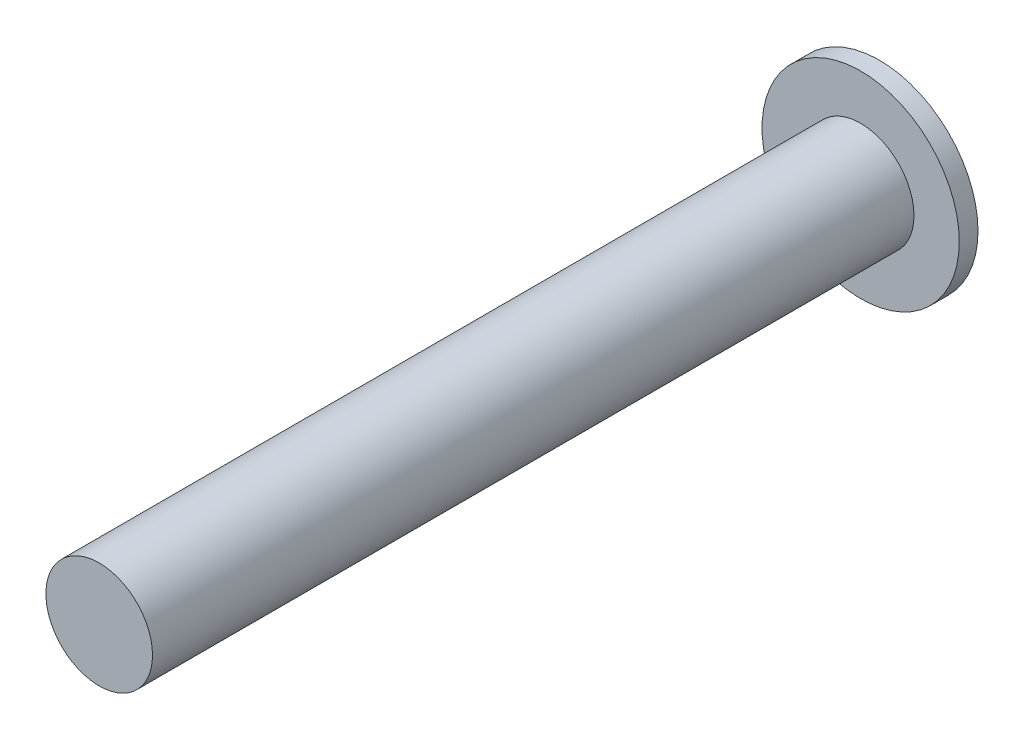
ISO-10303-21;
HEADER;
FILE_DESCRIPTION(('STEP AP214'),'2;1');
FILE_NAME('part.step','',(''),(''),'','','');
FILE_SCHEMA(('AUTOMOTIVE_DESIGN { 1 0 10303 214 1 1 1 1 }'));
ENDSEC;
DATA;
#1=APPLICATION_CONTEXT('core data for automotive mechanical design processes');
#2=APPLICATION_PROTOCOL_DEFINITION('international standard','automotive_design',2000,#1);
#3=PRODUCT_CONTEXT('',#1,'mechanical');
#4=PRODUCT('Part','Part','',(#3));
#5=PRODUCT_RELATED_PRODUCT_CATEGORY('part','',(#4));
#6=PRODUCT_DEFINITION_FORMATION('','',#4);
#7=PRODUCT_DEFINITION_CONTEXT('part definition',#1,'design');
#8=PRODUCT_DEFINITION('design','',#6,#7);
#9=PRODUCT_DEFINITION_SHAPE('','',#8);
#10=(LENGTH_UNIT() NAMED_UNIT(*) SI_UNIT(.MILLI.,.METRE.));
#11=(NAMED_UNIT(*) PLANE_ANGLE_UNIT() SI_UNIT($,.RADIAN.));
#12=(NAMED_UNIT(*) SI_UNIT($,.STERADIAN.) SOLID_ANGLE_UNIT());
#13=UNCERTAINTY_MEASURE_WITH_UNIT(LENGTH_MEASURE(1.E-05),#10,'distance_accuracy_value','');
#14=(GEOMETRIC_REPRESENTATION_CONTEXT(3) GLOBAL_UNCERTAINTY_ASSIGNED_CONTEXT((#13)) GLOBAL_UNIT_ASSIGNED_CONTEXT((#10,
#11,#12)) REPRESENTATION_CONTEXT('',''));
#15=CARTESIAN_POINT('',(0.,0.,0.));
#16=DIRECTION('',(0.,0.,1.));
#17=DIRECTION('',(1.,0.,0.));
#18=AXIS2_PLACEMENT_3D('',#15,#16,#17);
#19=CARTESIAN_POINT('',(0.,0.,1.23));
#20=DIRECTION('',(0.,0.,-1.));
#21=DIRECTION('',(-1.,0.,0.));
#22=AXIS2_PLACEMENT_3D('',#19,#20,#21);
#23=CYLINDRICAL_SURFACE('',#22,6.475);
#24=CARTESIAN_POINT('',(0.,0.,1.23));
#25=DIRECTION('',(0.,0.,1.));
#26=DIRECTION('',(1.,0.,0.));
#27=AXIS2_PLACEMENT_3D('',#24,#25,#26);
#28=CIRCLE('',#27,6.475);
#29=CARTESIAN_POINT('',(6.475,0.,1.23));
#30=VERTEX_POINT('',#29);
#31=EDGE_CURVE('E38',#30,#30,#28,.T.);
#32=ORIENTED_EDGE('',*,*,#31,.F.);
#33=EDGE_LOOP('',(#32));
#34=FACE_BOUND('',#33,.T.);
#35=CARTESIAN_POINT('',(0.,0.,0.));
#36=DIRECTION('',(0.,0.,1.));
#37=DIRECTION('',(1.,0.,0.));
#38=AXIS2_PLACEMENT_3D('',#35,#36,#37);
#39=CIRCLE('',#38,6.475);
#40=CARTESIAN_POINT('',(6.475,0.,0.));
#41=VERTEX_POINT('',#40);
#42=EDGE_CURVE('E34',#41,#41,#39,.T.);
#43=ORIENTED_EDGE('',*,*,#42,.T.);
#44=EDGE_LOOP('',(#43));
#45=FACE_BOUND('',#44,.T.);
#46=ADVANCED_FACE('F31',(#34,#45),#23,.T.);
#47=CARTESIAN_POINT('',(0.,0.,1.23));
#48=DIRECTION('',(0.,0.,1.));
#49=DIRECTION('',(1.,0.,0.));
#50=AXIS2_PLACEMENT_3D('',#47,#48,#49);
#51=PLANE('',#50);
#52=CARTESIAN_POINT('',(0.,0.,1.23));
#53=DIRECTION('',(0.,0.,1.));
#54=DIRECTION('',(1.,0.,0.));
#55=AXIS2_PLACEMENT_3D('',#52,#53,#54);
#56=CIRCLE('',#55,3.5);
#57=CARTESIAN_POINT('',(3.5,0.,1.23));
#58=VERTEX_POINT('',#57);
#59=EDGE_CURVE('E10',#58,#58,#56,.T.);
#60=ORIENTED_EDGE('',*,*,#59,.F.);
#61=EDGE_LOOP('',(#60));
#62=FACE_BOUND('',#61,.T.);
#63=ORIENTED_EDGE('',*,*,#31,.T.);
#64=EDGE_LOOP('',(#63));
#65=FACE_BOUND('',#64,.T.);
#66=ADVANCED_FACE('F55',(#62,#65),#51,.T.);
#67=CARTESIAN_POINT('',(0.,0.,0.));
#68=DIRECTION('',(0.,0.,1.));
#69=DIRECTION('',(1.,0.,0.));
#70=AXIS2_PLACEMENT_3D('',#67,#68,#69);
#71=PLANE('',#70);
#72=ORIENTED_EDGE('',*,*,#42,.F.);
#73=EDGE_LOOP('',(#72));
#74=FACE_BOUND('',#73,.T.);
#75=ADVANCED_FACE('F52',(#74),#71,.F.);
#76=CARTESIAN_POINT('',(0.,0.,51.23));
#77=DIRECTION('',(0.,0.,-1.));
#78=DIRECTION('',(-1.,0.,0.));
#79=AXIS2_PLACEMENT_3D('',#76,#77,#78);
#80=CYLINDRICAL_SURFACE('',#79,3.5);
#81=CARTESIAN_POINT('',(0.,0.,51.23));
#82=DIRECTION('',(0.,0.,1.));
#83=DIRECTION('',(1.,0.,0.));
#84=AXIS2_PLACEMENT_3D('',#81,#82,#83);
#85=CIRCLE('',#84,3.5);
#86=CARTESIAN_POINT('',(3.5,0.,51.23));
#87=VERTEX_POINT('',#86);
#88=EDGE_CURVE('E44',#87,#87,#85,.T.);
#89=ORIENTED_EDGE('',*,*,#88,.F.);
#90=EDGE_LOOP('',(#89));
#91=FACE_BOUND('',#90,.T.);
#92=ORIENTED_EDGE('',*,*,#59,.T.);
#93=EDGE_LOOP('',(#92));
#94=FACE_BOUND('',#93,.T.);
#95=ADVANCED_FACE('F54',(#91,#94),#80,.T.);
#96=CARTESIAN_POINT('',(0.,0.,51.23));
#97=DIRECTION('',(0.,0.,1.));
#98=DIRECTION('',(1.,0.,0.));
#99=AXIS2_PLACEMENT_3D('',#96,#97,#98);
#100=PLANE('',#99);
#101=ORIENTED_EDGE('',*,*,#88,.T.);
#102=EDGE_LOOP('',(#101));
#103=FACE_BOUND('',#102,.T.);
#104=ADVANCED_FACE('F60',(#103),#100,.T.);
#105=CLOSED_SHELL('',(#46,#66,#75,#95,#104));
#106=MANIFOLD_SOLID_BREP('B2',#105);
#107=ADVANCED_BREP_SHAPE_REPRESENTATION('',(#18,#106),#14);
#108=SHAPE_DEFINITION_REPRESENTATION(#9,#107);
ENDSEC;
END-ISO-10303-21;
